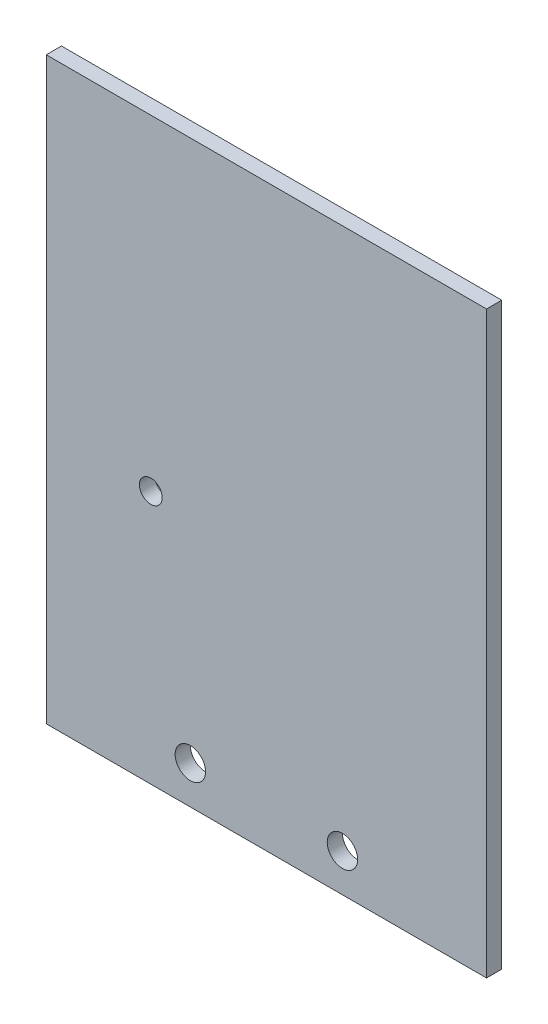
ISO-10303-21;
HEADER;
FILE_DESCRIPTION(('STEP AP214'),'2;1');
FILE_NAME('part.step','',(''),(''),'','','');
FILE_SCHEMA(('AUTOMOTIVE_DESIGN { 1 0 10303 214 1 1 1 1 }'));
ENDSEC;
DATA;
#1=APPLICATION_CONTEXT('core data for automotive mechanical design processes');
#2=APPLICATION_PROTOCOL_DEFINITION('international standard','automotive_design',2000,#1);
#3=PRODUCT_CONTEXT('',#1,'mechanical');
#4=PRODUCT('Part','Part','',(#3));
#5=PRODUCT_RELATED_PRODUCT_CATEGORY('part','',(#4));
#6=PRODUCT_DEFINITION_FORMATION('','',#4);
#7=PRODUCT_DEFINITION_CONTEXT('part definition',#1,'design');
#8=PRODUCT_DEFINITION('design','',#6,#7);
#9=PRODUCT_DEFINITION_SHAPE('','',#8);
#10=(LENGTH_UNIT() NAMED_UNIT(*) SI_UNIT(.MILLI.,.METRE.));
#11=(NAMED_UNIT(*) PLANE_ANGLE_UNIT() SI_UNIT($,.RADIAN.));
#12=(NAMED_UNIT(*) SI_UNIT($,.STERADIAN.) SOLID_ANGLE_UNIT());
#13=UNCERTAINTY_MEASURE_WITH_UNIT(LENGTH_MEASURE(1.E-05),#10,'distance_accuracy_value','');
#14=(GEOMETRIC_REPRESENTATION_CONTEXT(3) GLOBAL_UNCERTAINTY_ASSIGNED_CONTEXT((#13)) GLOBAL_UNIT_ASSIGNED_CONTEXT((#10,
#11,#12)) REPRESENTATION_CONTEXT('',''));
#15=CARTESIAN_POINT('',(0.,0.,0.));
#16=DIRECTION('',(0.,0.,1.));
#17=DIRECTION('',(1.,0.,0.));
#18=AXIS2_PLACEMENT_3D('',#15,#16,#17);
#19=CARTESIAN_POINT('',(-35.5403922344283,29.2034183120229,2.));
#20=DIRECTION('',(1.,0.,0.));
#21=DIRECTION('',(0.,0.,-1.));
#22=AXIS2_PLACEMENT_3D('',#19,#20,#21);
#23=PLANE('',#22);
#24=DIRECTION('',(0.,-1.,0.));
#25=VECTOR('',#24,1.);
#26=CARTESIAN_POINT('',(-35.5403922344283,29.2034183120229,-8.));
#27=LINE('',#26,#25);
#28=CARTESIAN_POINT('',(-35.5403922344283,29.2034183120229,-8.));
#29=VERTEX_POINT('',#28);
#30=CARTESIAN_POINT('',(-35.5403922344283,-46.9965816879772,-8.));
#31=VERTEX_POINT('',#30);
#32=EDGE_CURVE('E89',#29,#31,#27,.T.);
#33=ORIENTED_EDGE('',*,*,#32,.F.);
#34=DIRECTION('',(0.,0.,-1.));
#35=VECTOR('',#34,1.);
#36=CARTESIAN_POINT('',(-35.5403922344283,29.2034183120229,2.));
#37=LINE('',#36,#35);
#38=CARTESIAN_POINT('',(-35.5403922344283,29.2034183120229,-10.));
#39=VERTEX_POINT('',#38);
#40=EDGE_CURVE('E107',#29,#39,#37,.T.);
#41=ORIENTED_EDGE('',*,*,#40,.T.);
#42=DIRECTION('',(0.,1.,0.));
#43=VECTOR('',#42,1.);
#44=CARTESIAN_POINT('',(-35.5403922344283,0.,-10.));
#45=LINE('',#44,#43);
#46=CARTESIAN_POINT('',(-35.5403922344283,-46.9965816879772,-10.));
#47=VERTEX_POINT('',#46);
#48=EDGE_CURVE('E105',#47,#39,#45,.T.);
#49=ORIENTED_EDGE('',*,*,#48,.F.);
#50=DIRECTION('',(0.,0.,-1.));
#51=VECTOR('',#50,1.);
#52=CARTESIAN_POINT('',(-35.5403922344283,-46.9965816879772,2.));
#53=LINE('',#52,#51);
#54=EDGE_CURVE('E12',#31,#47,#53,.T.);
#55=ORIENTED_EDGE('',*,*,#54,.F.);
#56=EDGE_LOOP('',(#33,#41,#49,#55));
#57=FACE_BOUND('',#56,.T.);
#58=ADVANCED_FACE('F52',(#57),#23,.F.);
#59=CARTESIAN_POINT('',(-35.5403922344283,-46.9965816879772,2.));
#60=DIRECTION('',(0.,1.,0.));
#61=DIRECTION('',(0.,0.,1.));
#62=AXIS2_PLACEMENT_3D('',#59,#60,#61);
#63=PLANE('',#62);
#64=DIRECTION('',(1.,0.,0.));
#65=VECTOR('',#64,1.);
#66=CARTESIAN_POINT('',(-35.5403922344283,-46.9965816879772,-8.));
#67=LINE('',#66,#65);
#68=CARTESIAN_POINT('',(22.3596077655717,-46.9965816879772,-8.));
#69=VERTEX_POINT('',#68);
#70=EDGE_CURVE('E93',#31,#69,#67,.T.);
#71=ORIENTED_EDGE('',*,*,#70,.F.);
#72=ORIENTED_EDGE('',*,*,#54,.T.);
#73=DIRECTION('',(-1.,0.,0.));
#74=VECTOR('',#73,1.);
#75=CARTESIAN_POINT('',(0.,-46.9965816879772,-10.));
#76=LINE('',#75,#74);
#77=CARTESIAN_POINT('',(22.3596077655717,-46.9965816879772,-10.));
#78=VERTEX_POINT('',#77);
#79=EDGE_CURVE('E112',#78,#47,#76,.T.);
#80=ORIENTED_EDGE('',*,*,#79,.F.);
#81=DIRECTION('',(0.,0.,-1.));
#82=VECTOR('',#81,1.);
#83=CARTESIAN_POINT('',(22.3596077655717,-46.9965816879772,2.));
#84=LINE('',#83,#82);
#85=EDGE_CURVE('E59',#69,#78,#84,.T.);
#86=ORIENTED_EDGE('',*,*,#85,.F.);
#87=EDGE_LOOP('',(#71,#72,#80,#86));
#88=FACE_BOUND('',#87,.T.);
#89=ADVANCED_FACE('F100',(#88),#63,.F.);
#90=CARTESIAN_POINT('',(22.3596077655717,29.2034183120229,2.));
#91=DIRECTION('',(-1.,0.,0.));
#92=DIRECTION('',(0.,-1.,0.));
#93=AXIS2_PLACEMENT_3D('',#90,#91,#92);
#94=PLANE('',#93);
#95=DIRECTION('',(0.,1.,0.));
#96=VECTOR('',#95,1.);
#97=CARTESIAN_POINT('',(22.3596077655717,29.2034183120229,-8.));
#98=LINE('',#97,#96);
#99=CARTESIAN_POINT('',(22.3596077655717,29.2034183120229,-8.));
#100=VERTEX_POINT('',#99);
#101=EDGE_CURVE('E66',#69,#100,#98,.T.);
#102=ORIENTED_EDGE('',*,*,#101,.F.);
#103=ORIENTED_EDGE('',*,*,#85,.T.);
#104=DIRECTION('',(0.,-1.,0.));
#105=VECTOR('',#104,1.);
#106=CARTESIAN_POINT('',(22.3596077655717,0.,-10.));
#107=LINE('',#106,#105);
#108=CARTESIAN_POINT('',(22.3596077655717,29.2034183120229,-10.));
#109=VERTEX_POINT('',#108);
#110=EDGE_CURVE('E115',#109,#78,#107,.T.);
#111=ORIENTED_EDGE('',*,*,#110,.F.);
#112=DIRECTION('',(0.,0.,-1.));
#113=VECTOR('',#112,1.);
#114=CARTESIAN_POINT('',(22.3596077655717,29.2034183120229,2.));
#115=LINE('',#114,#113);
#116=EDGE_CURVE('E126',#100,#109,#115,.T.);
#117=ORIENTED_EDGE('',*,*,#116,.F.);
#118=EDGE_LOOP('',(#102,#103,#111,#117));
#119=FACE_BOUND('',#118,.T.);
#120=ADVANCED_FACE('F130',(#119),#94,.F.);
#121=CARTESIAN_POINT('',(-35.5403922344283,29.2034183120229,2.));
#122=DIRECTION('',(0.,-1.,0.));
#123=DIRECTION('',(0.,0.,-1.));
#124=AXIS2_PLACEMENT_3D('',#121,#122,#123);
#125=PLANE('',#124);
#126=DIRECTION('',(-1.,0.,0.));
#127=VECTOR('',#126,1.);
#128=CARTESIAN_POINT('',(-35.5403922344283,29.2034183120229,-8.));
#129=LINE('',#128,#127);
#130=EDGE_CURVE('E94',#100,#29,#129,.T.);
#131=ORIENTED_EDGE('',*,*,#130,.F.);
#132=ORIENTED_EDGE('',*,*,#116,.T.);
#133=DIRECTION('',(1.,0.,0.));
#134=VECTOR('',#133,1.);
#135=CARTESIAN_POINT('',(0.,29.2034183120229,-10.));
#136=LINE('',#135,#134);
#137=EDGE_CURVE('E111',#39,#109,#136,.T.);
#138=ORIENTED_EDGE('',*,*,#137,.F.);
#139=ORIENTED_EDGE('',*,*,#40,.F.);
#140=EDGE_LOOP('',(#131,#132,#138,#139));
#141=FACE_BOUND('',#140,.T.);
#142=ADVANCED_FACE('F129',(#141),#125,.F.);
#143=CARTESIAN_POINT('',(-16.5903922344283,-41.9965816879772,17.6204993518133));
#144=DIRECTION('',(0.,0.,-1.));
#145=DIRECTION('',(-1.,0.,0.));
#146=AXIS2_PLACEMENT_3D('',#143,#144,#145);
#147=CYLINDRICAL_SURFACE('',#146,2.);
#148=CARTESIAN_POINT('',(-16.5903922344283,-41.9965816879772,-10.));
#149=DIRECTION('',(0.,0.,-1.));
#150=DIRECTION('',(-1.,0.,0.));
#151=AXIS2_PLACEMENT_3D('',#148,#149,#150);
#152=CIRCLE('',#151,2.);
#153=CARTESIAN_POINT('',(-18.5903922344283,-41.9965816879772,-10.));
#154=VERTEX_POINT('',#153);
#155=EDGE_CURVE('E237',#154,#154,#152,.F.);
#156=ORIENTED_EDGE('',*,*,#155,.F.);
#157=EDGE_LOOP('',(#156));
#158=FACE_BOUND('',#157,.T.);
#159=CARTESIAN_POINT('',(-16.5903922344283,-41.9965816879772,-8.));
#160=DIRECTION('',(0.,0.,1.));
#161=DIRECTION('',(1.,0.,0.));
#162=AXIS2_PLACEMENT_3D('',#159,#160,#161);
#163=CIRCLE('',#162,2.);
#164=CARTESIAN_POINT('',(-14.5903922344283,-41.9965816879772,-8.));
#165=VERTEX_POINT('',#164);
#166=EDGE_CURVE('E247',#165,#165,#163,.F.);
#167=ORIENTED_EDGE('',*,*,#166,.F.);
#168=EDGE_LOOP('',(#167));
#169=FACE_BOUND('',#168,.T.);
#170=ADVANCED_FACE('F137',(#158,#169),#147,.F.);
#171=CARTESIAN_POINT('',(3.40960776557173,-41.9965816879772,17.6204993518133));
#172=DIRECTION('',(0.,0.,-1.));
#173=DIRECTION('',(-1.,0.,0.));
#174=AXIS2_PLACEMENT_3D('',#171,#172,#173);
#175=CYLINDRICAL_SURFACE('',#174,2.);
#176=CARTESIAN_POINT('',(3.40960776557173,-41.9965816879772,-10.));
#177=DIRECTION('',(0.,0.,-1.));
#178=DIRECTION('',(-1.,0.,0.));
#179=AXIS2_PLACEMENT_3D('',#176,#177,#178);
#180=CIRCLE('',#179,2.);
#181=CARTESIAN_POINT('',(1.40960776557173,-41.9965816879772,-10.));
#182=VERTEX_POINT('',#181);
#183=EDGE_CURVE('E116',#182,#182,#180,.F.);
#184=ORIENTED_EDGE('',*,*,#183,.F.);
#185=EDGE_LOOP('',(#184));
#186=FACE_BOUND('',#185,.T.);
#187=CARTESIAN_POINT('',(3.40960776557173,-41.9965816879772,-8.));
#188=DIRECTION('',(0.,0.,1.));
#189=DIRECTION('',(1.,0.,0.));
#190=AXIS2_PLACEMENT_3D('',#187,#188,#189);
#191=CIRCLE('',#190,2.);
#192=CARTESIAN_POINT('',(5.40960776557173,-41.9965816879772,-8.));
#193=VERTEX_POINT('',#192);
#194=EDGE_CURVE('E245',#193,#193,#191,.F.);
#195=ORIENTED_EDGE('',*,*,#194,.F.);
#196=EDGE_LOOP('',(#195));
#197=FACE_BOUND('',#196,.T.);
#198=ADVANCED_FACE('F171',(#186,#197),#175,.F.);
#199=CARTESIAN_POINT('',(-21.7903922344283,-13.6265816879771,17.6204993518133));
#200=DIRECTION('',(0.,0.,-1.));
#201=DIRECTION('',(-1.,0.,0.));
#202=AXIS2_PLACEMENT_3D('',#199,#200,#201);
#203=CYLINDRICAL_SURFACE('',#202,1.5);
#204=CARTESIAN_POINT('',(-21.7903922344283,-13.6265816879771,-10.));
#205=DIRECTION('',(0.,0.,-1.));
#206=DIRECTION('',(-1.,0.,0.));
#207=AXIS2_PLACEMENT_3D('',#204,#205,#206);
#208=CIRCLE('',#207,1.5);
#209=CARTESIAN_POINT('',(-23.2903922344283,-13.6265816879771,-10.));
#210=VERTEX_POINT('',#209);
#211=EDGE_CURVE('E119',#210,#210,#208,.F.);
#212=ORIENTED_EDGE('',*,*,#211,.F.);
#213=EDGE_LOOP('',(#212));
#214=FACE_BOUND('',#213,.T.);
#215=CARTESIAN_POINT('',(-21.7903922344283,-13.6265816879771,-8.));
#216=DIRECTION('',(0.,0.,1.));
#217=DIRECTION('',(1.,0.,0.));
#218=AXIS2_PLACEMENT_3D('',#215,#216,#217);
#219=CIRCLE('',#218,1.5);
#220=CARTESIAN_POINT('',(-20.2903922344283,-13.6265816879771,-8.));
#221=VERTEX_POINT('',#220);
#222=EDGE_CURVE('E248',#221,#221,#219,.F.);
#223=ORIENTED_EDGE('',*,*,#222,.F.);
#224=EDGE_LOOP('',(#223));
#225=FACE_BOUND('',#224,.T.);
#226=ADVANCED_FACE('F183',(#214,#225),#203,.F.);
#227=CARTESIAN_POINT('',(0.,0.,-10.));
#228=DIRECTION('',(0.,0.,-1.));
#229=DIRECTION('',(-1.,0.,0.));
#230=AXIS2_PLACEMENT_3D('',#227,#228,#229);
#231=PLANE('',#230);
#232=ORIENTED_EDGE('',*,*,#155,.T.);
#233=EDGE_LOOP('',(#232));
#234=FACE_BOUND('',#233,.T.);
#235=ORIENTED_EDGE('',*,*,#211,.T.);
#236=EDGE_LOOP('',(#235));
#237=FACE_BOUND('',#236,.T.);
#238=ORIENTED_EDGE('',*,*,#183,.T.);
#239=EDGE_LOOP('',(#238));
#240=FACE_BOUND('',#239,.T.);
#241=ORIENTED_EDGE('',*,*,#79,.T.);
#242=ORIENTED_EDGE('',*,*,#48,.T.);
#243=ORIENTED_EDGE('',*,*,#137,.T.);
#244=ORIENTED_EDGE('',*,*,#110,.T.);
#245=EDGE_LOOP('',(#241,#242,#243,#244));
#246=FACE_BOUND('',#245,.T.);
#247=ADVANCED_FACE('F114',(#234,#237,#240,#246),#231,.T.);
#248=CARTESIAN_POINT('',(0.,0.,-8.));
#249=DIRECTION('',(0.,0.,1.));
#250=DIRECTION('',(1.,0.,0.));
#251=AXIS2_PLACEMENT_3D('',#248,#249,#250);
#252=PLANE('',#251);
#253=ORIENTED_EDGE('',*,*,#32,.T.);
#254=ORIENTED_EDGE('',*,*,#70,.T.);
#255=ORIENTED_EDGE('',*,*,#101,.T.);
#256=ORIENTED_EDGE('',*,*,#130,.T.);
#257=EDGE_LOOP('',(#253,#254,#255,#256));
#258=FACE_BOUND('',#257,.T.);
#259=ORIENTED_EDGE('',*,*,#222,.T.);
#260=EDGE_LOOP('',(#259));
#261=FACE_BOUND('',#260,.T.);
#262=ORIENTED_EDGE('',*,*,#194,.T.);
#263=EDGE_LOOP('',(#262));
#264=FACE_BOUND('',#263,.T.);
#265=ORIENTED_EDGE('',*,*,#166,.T.);
#266=EDGE_LOOP('',(#265));
#267=FACE_BOUND('',#266,.T.);
#268=ADVANCED_FACE('F91',(#258,#261,#264,#267),#252,.T.);
#269=CLOSED_SHELL('',(#58,#89,#120,#142,#170,#198,#226,#247,#268));
#270=MANIFOLD_SOLID_BREP('B2',#269);
#271=ADVANCED_BREP_SHAPE_REPRESENTATION('',(#18,#270),#14);
#272=SHAPE_DEFINITION_REPRESENTATION(#9,#271);
ENDSEC;
END-ISO-10303-21;
